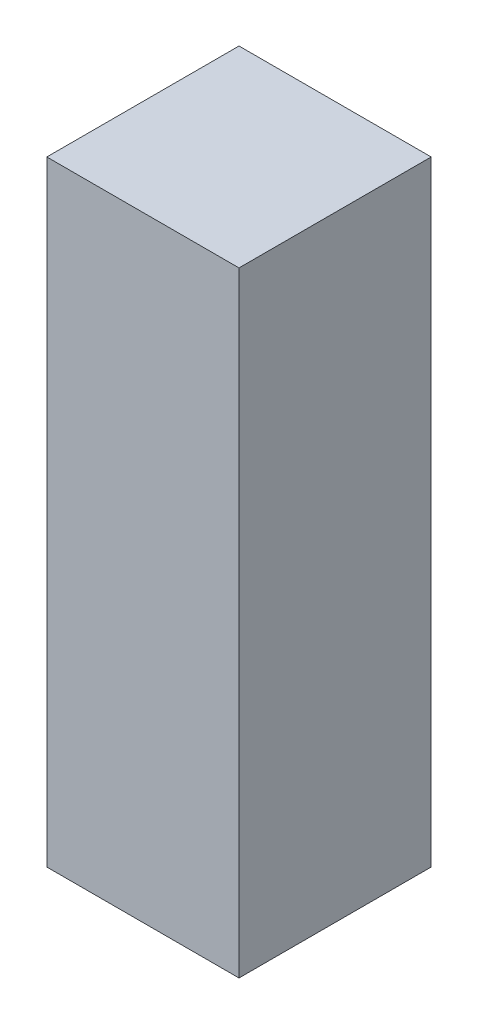
ISO-10303-21;
HEADER;
FILE_DESCRIPTION(('STEP AP214'),'2;1');
FILE_NAME('part.step','',(''),(''),'','','');
FILE_SCHEMA(('AUTOMOTIVE_DESIGN { 1 0 10303 214 1 1 1 1 }'));
ENDSEC;
DATA;
#1=APPLICATION_CONTEXT('core data for automotive mechanical design processes');
#2=APPLICATION_PROTOCOL_DEFINITION('international standard','automotive_design',2000,#1);
#3=PRODUCT_CONTEXT('',#1,'mechanical');
#4=PRODUCT('Part','Part','',(#3));
#5=PRODUCT_RELATED_PRODUCT_CATEGORY('part','',(#4));
#6=PRODUCT_DEFINITION_FORMATION('','',#4);
#7=PRODUCT_DEFINITION_CONTEXT('part definition',#1,'design');
#8=PRODUCT_DEFINITION('design','',#6,#7);
#9=PRODUCT_DEFINITION_SHAPE('','',#8);
#10=(LENGTH_UNIT() NAMED_UNIT(*) SI_UNIT(.MILLI.,.METRE.));
#11=(NAMED_UNIT(*) PLANE_ANGLE_UNIT() SI_UNIT($,.RADIAN.));
#12=(NAMED_UNIT(*) SI_UNIT($,.STERADIAN.) SOLID_ANGLE_UNIT());
#13=UNCERTAINTY_MEASURE_WITH_UNIT(LENGTH_MEASURE(1.E-05),#10,'distance_accuracy_value','');
#14=(GEOMETRIC_REPRESENTATION_CONTEXT(3) GLOBAL_UNCERTAINTY_ASSIGNED_CONTEXT((#13)) GLOBAL_UNIT_ASSIGNED_CONTEXT((#10,
#11,#12)) REPRESENTATION_CONTEXT('',''));
#15=CARTESIAN_POINT('',(0.,0.,0.));
#16=DIRECTION('',(0.,0.,1.));
#17=DIRECTION('',(1.,0.,0.));
#18=AXIS2_PLACEMENT_3D('',#15,#16,#17);
#19=CARTESIAN_POINT('',(46.5,22.5,219.));
#20=DIRECTION('',(0.,0.,1.));
#21=DIRECTION('',(1.,0.,0.));
#22=AXIS2_PLACEMENT_3D('',#19,#20,#21);
#23=PLANE('',#22);
#24=DIRECTION('',(-1.,0.,0.));
#25=VECTOR('',#24,1.);
#26=CARTESIAN_POINT('',(46.5,22.5,219.));
#27=LINE('',#26,#25);
#28=CARTESIAN_POINT('',(46.5,22.5,219.));
#29=VERTEX_POINT('',#28);
#30=CARTESIAN_POINT('',(36.5,22.5,219.));
#31=VERTEX_POINT('',#30);
#32=EDGE_CURVE('E78',#29,#31,#27,.T.);
#33=ORIENTED_EDGE('',*,*,#32,.F.);
#34=DIRECTION('',(0.,1.,0.));
#35=VECTOR('',#34,1.);
#36=CARTESIAN_POINT('',(46.5,22.5,219.));
#37=LINE('',#36,#35);
#38=CARTESIAN_POINT('',(46.5,54.5,219.));
#39=VERTEX_POINT('',#38);
#40=EDGE_CURVE('E65',#29,#39,#37,.T.);
#41=ORIENTED_EDGE('',*,*,#40,.T.);
#42=DIRECTION('',(-1.,0.,0.));
#43=VECTOR('',#42,1.);
#44=CARTESIAN_POINT('',(46.5,54.5,219.));
#45=LINE('',#44,#43);
#46=CARTESIAN_POINT('',(36.5,54.5,219.));
#47=VERTEX_POINT('',#46);
#48=EDGE_CURVE('E75',#39,#47,#45,.T.);
#49=ORIENTED_EDGE('',*,*,#48,.T.);
#50=DIRECTION('',(0.,1.,0.));
#51=VECTOR('',#50,1.);
#52=CARTESIAN_POINT('',(36.5,22.5,219.));
#53=LINE('',#52,#51);
#54=EDGE_CURVE('E9',#31,#47,#53,.T.);
#55=ORIENTED_EDGE('',*,*,#54,.F.);
#56=EDGE_LOOP('',(#33,#41,#49,#55));
#57=FACE_BOUND('',#56,.T.);
#58=ADVANCED_FACE('F14',(#57),#23,.T.);
#59=CARTESIAN_POINT('',(46.5,22.5,209.));
#60=DIRECTION('',(0.,0.,1.));
#61=DIRECTION('',(1.,0.,0.));
#62=AXIS2_PLACEMENT_3D('',#59,#60,#61);
#63=PLANE('',#62);
#64=DIRECTION('',(0.,1.,0.));
#65=VECTOR('',#64,1.);
#66=CARTESIAN_POINT('',(36.5,22.5,209.));
#67=LINE('',#66,#65);
#68=CARTESIAN_POINT('',(36.5,22.5,209.));
#69=VERTEX_POINT('',#68);
#70=CARTESIAN_POINT('',(36.5,54.5,209.));
#71=VERTEX_POINT('',#70);
#72=EDGE_CURVE('E25',#69,#71,#67,.T.);
#73=ORIENTED_EDGE('',*,*,#72,.T.);
#74=DIRECTION('',(-1.,0.,0.));
#75=VECTOR('',#74,1.);
#76=CARTESIAN_POINT('',(46.5,54.5,209.));
#77=LINE('',#76,#75);
#78=CARTESIAN_POINT('',(46.5,54.5,209.));
#79=VERTEX_POINT('',#78);
#80=EDGE_CURVE('E91',#79,#71,#77,.T.);
#81=ORIENTED_EDGE('',*,*,#80,.F.);
#82=DIRECTION('',(0.,1.,0.));
#83=VECTOR('',#82,1.);
#84=CARTESIAN_POINT('',(46.5,22.5,209.));
#85=LINE('',#84,#83);
#86=CARTESIAN_POINT('',(46.5,22.5,209.));
#87=VERTEX_POINT('',#86);
#88=EDGE_CURVE('E69',#87,#79,#85,.T.);
#89=ORIENTED_EDGE('',*,*,#88,.F.);
#90=DIRECTION('',(-1.,0.,0.));
#91=VECTOR('',#90,1.);
#92=CARTESIAN_POINT('',(46.5,22.5,209.));
#93=LINE('',#92,#91);
#94=EDGE_CURVE('E99',#87,#69,#93,.T.);
#95=ORIENTED_EDGE('',*,*,#94,.T.);
#96=EDGE_LOOP('',(#73,#81,#89,#95));
#97=FACE_BOUND('',#96,.T.);
#98=ADVANCED_FACE('F117',(#97),#63,.F.);
#99=CARTESIAN_POINT('',(36.5,22.5,209.));
#100=DIRECTION('',(-1.,0.,0.));
#101=DIRECTION('',(0.,0.,1.));
#102=AXIS2_PLACEMENT_3D('',#99,#100,#101);
#103=PLANE('',#102);
#104=ORIENTED_EDGE('',*,*,#72,.F.);
#105=DIRECTION('',(0.,0.,1.));
#106=VECTOR('',#105,1.);
#107=CARTESIAN_POINT('',(36.5,22.5,209.));
#108=LINE('',#107,#106);
#109=EDGE_CURVE('E102',#69,#31,#108,.T.);
#110=ORIENTED_EDGE('',*,*,#109,.T.);
#111=ORIENTED_EDGE('',*,*,#54,.T.);
#112=DIRECTION('',(0.,0.,1.));
#113=VECTOR('',#112,1.);
#114=CARTESIAN_POINT('',(36.5,54.5,209.));
#115=LINE('',#114,#113);
#116=EDGE_CURVE('E86',#71,#47,#115,.T.);
#117=ORIENTED_EDGE('',*,*,#116,.F.);
#118=EDGE_LOOP('',(#104,#110,#111,#117));
#119=FACE_BOUND('',#118,.T.);
#120=ADVANCED_FACE('F118',(#119),#103,.T.);
#121=CARTESIAN_POINT('',(46.5,22.5,209.));
#122=DIRECTION('',(-1.,0.,0.));
#123=DIRECTION('',(0.,0.,1.));
#124=AXIS2_PLACEMENT_3D('',#121,#122,#123);
#125=PLANE('',#124);
#126=DIRECTION('',(0.,0.,1.));
#127=VECTOR('',#126,1.);
#128=CARTESIAN_POINT('',(46.5,54.5,209.));
#129=LINE('',#128,#127);
#130=EDGE_CURVE('E85',#79,#39,#129,.T.);
#131=ORIENTED_EDGE('',*,*,#130,.T.);
#132=ORIENTED_EDGE('',*,*,#40,.F.);
#133=DIRECTION('',(0.,0.,1.));
#134=VECTOR('',#133,1.);
#135=CARTESIAN_POINT('',(46.5,22.5,209.));
#136=LINE('',#135,#134);
#137=EDGE_CURVE('E18',#87,#29,#136,.T.);
#138=ORIENTED_EDGE('',*,*,#137,.F.);
#139=ORIENTED_EDGE('',*,*,#88,.T.);
#140=EDGE_LOOP('',(#131,#132,#138,#139));
#141=FACE_BOUND('',#140,.T.);
#142=ADVANCED_FACE('F89',(#141),#125,.F.);
#143=CARTESIAN_POINT('',(46.5,54.5,209.));
#144=DIRECTION('',(0.,1.,0.));
#145=DIRECTION('',(1.,0.,0.));
#146=AXIS2_PLACEMENT_3D('',#143,#144,#145);
#147=PLANE('',#146);
#148=ORIENTED_EDGE('',*,*,#130,.F.);
#149=ORIENTED_EDGE('',*,*,#80,.T.);
#150=ORIENTED_EDGE('',*,*,#116,.T.);
#151=ORIENTED_EDGE('',*,*,#48,.F.);
#152=EDGE_LOOP('',(#148,#149,#150,#151));
#153=FACE_BOUND('',#152,.T.);
#154=ADVANCED_FACE('F83',(#153),#147,.T.);
#155=CARTESIAN_POINT('',(46.5,22.5,209.));
#156=DIRECTION('',(0.,1.,0.));
#157=DIRECTION('',(1.,0.,0.));
#158=AXIS2_PLACEMENT_3D('',#155,#156,#157);
#159=PLANE('',#158);
#160=ORIENTED_EDGE('',*,*,#32,.T.);
#161=ORIENTED_EDGE('',*,*,#109,.F.);
#162=ORIENTED_EDGE('',*,*,#94,.F.);
#163=ORIENTED_EDGE('',*,*,#137,.T.);
#164=EDGE_LOOP('',(#160,#161,#162,#163));
#165=FACE_BOUND('',#164,.T.);
#166=ADVANCED_FACE('F16',(#165),#159,.F.);
#167=CLOSED_SHELL('',(#58,#98,#120,#142,#154,#166));
#168=MANIFOLD_SOLID_BREP('B1',#167);
#169=ADVANCED_BREP_SHAPE_REPRESENTATION('',(#18,#168),#14);
#170=SHAPE_DEFINITION_REPRESENTATION(#9,#169);
ENDSEC;
END-ISO-10303-21;
